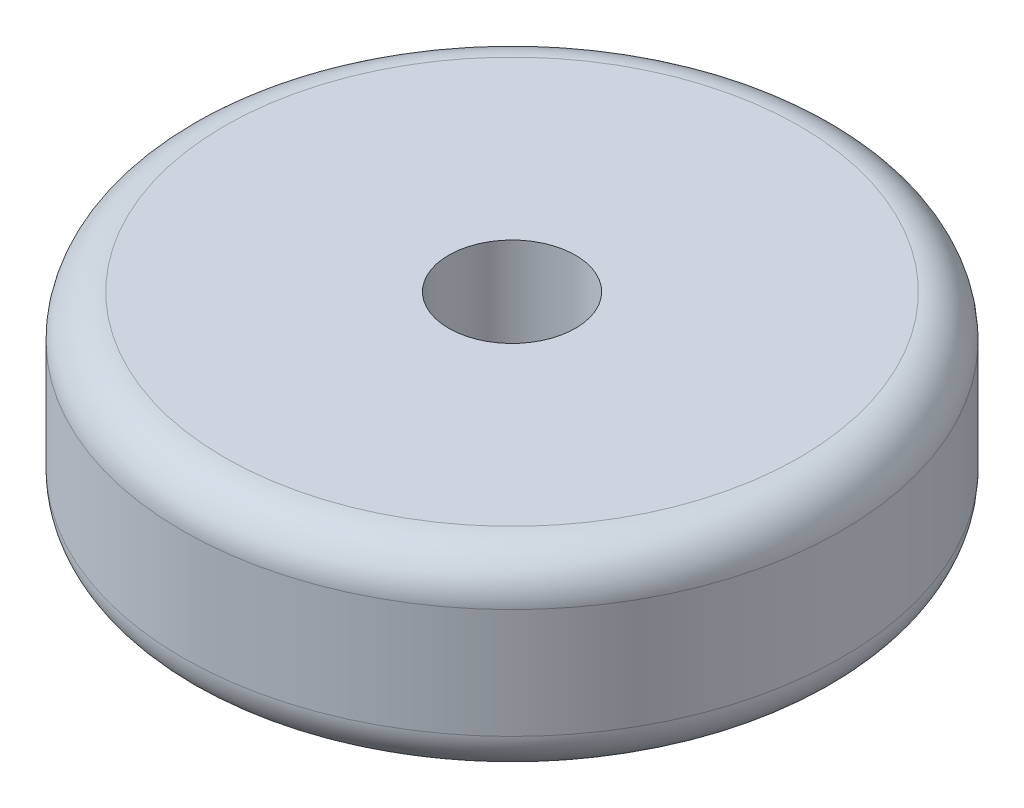
ISO-10303-21;
HEADER;
FILE_DESCRIPTION(('STEP AP214'),'2;1');
FILE_NAME('part.step','',(''),(''),'','','');
FILE_SCHEMA(('AUTOMOTIVE_DESIGN { 1 0 10303 214 1 1 1 1 }'));
ENDSEC;
DATA;
#1=APPLICATION_CONTEXT('core data for automotive mechanical design processes');
#2=APPLICATION_PROTOCOL_DEFINITION('international standard','automotive_design',2000,#1);
#3=PRODUCT_CONTEXT('',#1,'mechanical');
#4=PRODUCT('Part','Part','',(#3));
#5=PRODUCT_RELATED_PRODUCT_CATEGORY('part','',(#4));
#6=PRODUCT_DEFINITION_FORMATION('','',#4);
#7=PRODUCT_DEFINITION_CONTEXT('part definition',#1,'design');
#8=PRODUCT_DEFINITION('design','',#6,#7);
#9=PRODUCT_DEFINITION_SHAPE('','',#8);
#10=(LENGTH_UNIT() NAMED_UNIT(*) SI_UNIT(.MILLI.,.METRE.));
#11=(NAMED_UNIT(*) PLANE_ANGLE_UNIT() SI_UNIT($,.RADIAN.));
#12=(NAMED_UNIT(*) SI_UNIT($,.STERADIAN.) SOLID_ANGLE_UNIT());
#13=UNCERTAINTY_MEASURE_WITH_UNIT(LENGTH_MEASURE(1.E-05),#10,'distance_accuracy_value','');
#14=(GEOMETRIC_REPRESENTATION_CONTEXT(3) GLOBAL_UNCERTAINTY_ASSIGNED_CONTEXT((#13)) GLOBAL_UNIT_ASSIGNED_CONTEXT((#10,
#11,#12)) REPRESENTATION_CONTEXT('',''));
#15=CARTESIAN_POINT('',(0.,0.,0.));
#16=DIRECTION('',(0.,0.,1.));
#17=DIRECTION('',(1.,0.,0.));
#18=AXIS2_PLACEMENT_3D('',#15,#16,#17);
#19=CARTESIAN_POINT('',(0.,11.5,0.));
#20=DIRECTION('',(0.,-1.,0.));
#21=DIRECTION('',(0.,0.,-1.));
#22=AXIS2_PLACEMENT_3D('',#19,#20,#21);
#23=CYLINDRICAL_SURFACE('',#22,39.);
#24=CARTESIAN_POINT('',(0.,-6.5,0.));
#25=DIRECTION('',(0.,1.,0.));
#26=DIRECTION('',(0.,0.,1.));
#27=AXIS2_PLACEMENT_3D('',#24,#25,#26);
#28=CIRCLE('',#27,39.);
#29=CARTESIAN_POINT('',(0.,-6.5,39.));
#30=VERTEX_POINT('',#29);
#31=EDGE_CURVE('E50',#30,#30,#28,.T.);
#32=ORIENTED_EDGE('',*,*,#31,.T.);
#33=EDGE_LOOP('',(#32));
#34=FACE_BOUND('',#33,.T.);
#35=CARTESIAN_POINT('',(0.,6.5,0.));
#36=DIRECTION('',(0.,1.,0.));
#37=DIRECTION('',(0.,0.,1.));
#38=AXIS2_PLACEMENT_3D('',#35,#36,#37);
#39=CIRCLE('',#38,39.);
#40=CARTESIAN_POINT('',(0.,6.5,39.));
#41=VERTEX_POINT('',#40);
#42=EDGE_CURVE('E55',#41,#41,#39,.F.);
#43=ORIENTED_EDGE('',*,*,#42,.T.);
#44=EDGE_LOOP('',(#43));
#45=FACE_BOUND('',#44,.T.);
#46=ADVANCED_FACE('F37',(#34,#45),#23,.T.);
#47=CARTESIAN_POINT('',(0.,11.5,0.));
#48=DIRECTION('',(0.,1.,0.));
#49=DIRECTION('',(0.,0.,1.));
#50=AXIS2_PLACEMENT_3D('',#47,#48,#49);
#51=PLANE('',#50);
#52=CARTESIAN_POINT('',(0.,11.5,0.));
#53=DIRECTION('',(0.,1.,0.));
#54=DIRECTION('',(0.,0.,1.));
#55=AXIS2_PLACEMENT_3D('',#52,#53,#54);
#56=CIRCLE('',#55,7.5);
#57=CARTESIAN_POINT('',(0.,11.5,7.5));
#58=VERTEX_POINT('',#57);
#59=EDGE_CURVE('E61',#58,#58,#56,.T.);
#60=ORIENTED_EDGE('',*,*,#59,.F.);
#61=EDGE_LOOP('',(#60));
#62=FACE_BOUND('',#61,.T.);
#63=CARTESIAN_POINT('',(0.,11.5,0.));
#64=DIRECTION('',(0.,1.,0.));
#65=DIRECTION('',(0.,0.,1.));
#66=AXIS2_PLACEMENT_3D('',#63,#64,#65);
#67=CIRCLE('',#66,34.);
#68=CARTESIAN_POINT('',(0.,11.5,34.));
#69=VERTEX_POINT('',#68);
#70=EDGE_CURVE('E10',#69,#69,#67,.T.);
#71=ORIENTED_EDGE('',*,*,#70,.T.);
#72=EDGE_LOOP('',(#71));
#73=FACE_BOUND('',#72,.T.);
#74=ADVANCED_FACE('F83',(#62,#73),#51,.T.);
#75=CARTESIAN_POINT('',(0.,-11.5,0.));
#76=DIRECTION('',(0.,1.,0.));
#77=DIRECTION('',(0.,0.,1.));
#78=AXIS2_PLACEMENT_3D('',#75,#76,#77);
#79=PLANE('',#78);
#80=CARTESIAN_POINT('',(0.,-11.5,0.));
#81=DIRECTION('',(0.,1.,0.));
#82=DIRECTION('',(0.,0.,1.));
#83=AXIS2_PLACEMENT_3D('',#80,#81,#82);
#84=CIRCLE('',#83,7.5);
#85=CARTESIAN_POINT('',(0.,-11.5,7.5));
#86=VERTEX_POINT('',#85);
#87=EDGE_CURVE('E65',#86,#86,#84,.T.);
#88=ORIENTED_EDGE('',*,*,#87,.T.);
#89=EDGE_LOOP('',(#88));
#90=FACE_BOUND('',#89,.T.);
#91=CARTESIAN_POINT('',(0.,-11.5,0.));
#92=DIRECTION('',(0.,1.,0.));
#93=DIRECTION('',(0.,0.,1.));
#94=AXIS2_PLACEMENT_3D('',#91,#92,#93);
#95=CIRCLE('',#94,34.);
#96=CARTESIAN_POINT('',(0.,-11.5,34.));
#97=VERTEX_POINT('',#96);
#98=EDGE_CURVE('E45',#97,#97,#95,.F.);
#99=ORIENTED_EDGE('',*,*,#98,.T.);
#100=EDGE_LOOP('',(#99));
#101=FACE_BOUND('',#100,.T.);
#102=ADVANCED_FACE('F70',(#90,#101),#79,.F.);
#103=CARTESIAN_POINT('',(0.,-6.5,0.));
#104=DIRECTION('',(0.,1.,0.));
#105=DIRECTION('',(0.,0.,1.));
#106=AXIS2_PLACEMENT_3D('',#103,#104,#105);
#107=TOROIDAL_SURFACE('',#106,34.,5.);
#108=ORIENTED_EDGE('',*,*,#98,.F.);
#109=EDGE_LOOP('',(#108));
#110=FACE_BOUND('',#109,.T.);
#111=ORIENTED_EDGE('',*,*,#31,.F.);
#112=EDGE_LOOP('',(#111));
#113=FACE_BOUND('',#112,.T.);
#114=ADVANCED_FACE('F79',(#110,#113),#107,.T.);
#115=CARTESIAN_POINT('',(0.,6.5,0.));
#116=DIRECTION('',(0.,1.,0.));
#117=DIRECTION('',(0.,0.,1.));
#118=AXIS2_PLACEMENT_3D('',#115,#116,#117);
#119=TOROIDAL_SURFACE('',#118,34.,5.);
#120=ORIENTED_EDGE('',*,*,#42,.F.);
#121=EDGE_LOOP('',(#120));
#122=FACE_BOUND('',#121,.T.);
#123=ORIENTED_EDGE('',*,*,#70,.F.);
#124=EDGE_LOOP('',(#123));
#125=FACE_BOUND('',#124,.T.);
#126=ADVANCED_FACE('F39',(#122,#125),#119,.T.);
#127=CARTESIAN_POINT('',(0.,-11.5,0.));
#128=DIRECTION('',(0.,1.,0.));
#129=DIRECTION('',(0.,0.,1.));
#130=AXIS2_PLACEMENT_3D('',#127,#128,#129);
#131=CYLINDRICAL_SURFACE('',#130,7.5);
#132=ORIENTED_EDGE('',*,*,#59,.T.);
#133=EDGE_LOOP('',(#132));
#134=FACE_BOUND('',#133,.T.);
#135=ORIENTED_EDGE('',*,*,#87,.F.);
#136=EDGE_LOOP('',(#135));
#137=FACE_BOUND('',#136,.T.);
#138=ADVANCED_FACE('F72',(#134,#137),#131,.F.);
#139=CLOSED_SHELL('',(#46,#74,#102,#114,#126,#138));
#140=MANIFOLD_SOLID_BREP('B2',#139);
#141=ADVANCED_BREP_SHAPE_REPRESENTATION('',(#18,#140),#14);
#142=SHAPE_DEFINITION_REPRESENTATION(#9,#141);
ENDSEC;
END-ISO-10303-21;
